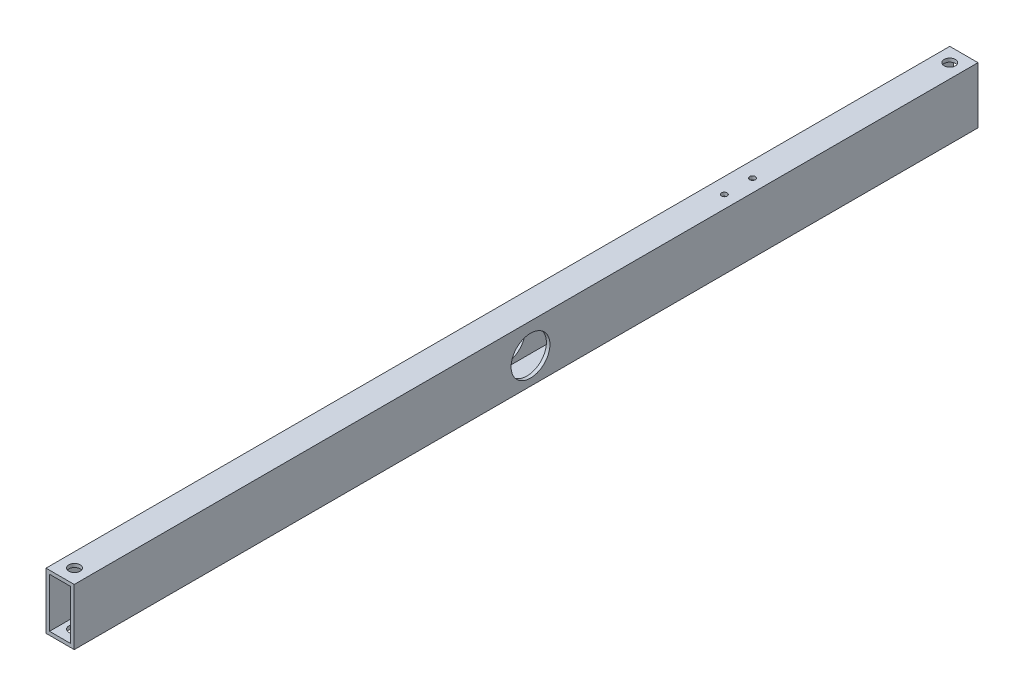
ISO-10303-21;
HEADER;
FILE_DESCRIPTION(('STEP AP214'),'2;1');
FILE_NAME('part.step','',(''),(''),'','','');
FILE_SCHEMA(('AUTOMOTIVE_DESIGN { 1 0 10303 214 1 1 1 1 }'));
ENDSEC;
DATA;
#1=APPLICATION_CONTEXT('core data for automotive mechanical design processes');
#2=APPLICATION_PROTOCOL_DEFINITION('international standard','automotive_design',2000,#1);
#3=PRODUCT_CONTEXT('',#1,'mechanical');
#4=PRODUCT('Part','Part','',(#3));
#5=PRODUCT_RELATED_PRODUCT_CATEGORY('part','',(#4));
#6=PRODUCT_DEFINITION_FORMATION('','',#4);
#7=PRODUCT_DEFINITION_CONTEXT('part definition',#1,'design');
#8=PRODUCT_DEFINITION('design','',#6,#7);
#9=PRODUCT_DEFINITION_SHAPE('','',#8);
#10=(LENGTH_UNIT() NAMED_UNIT(*) SI_UNIT(.MILLI.,.METRE.));
#11=(NAMED_UNIT(*) PLANE_ANGLE_UNIT() SI_UNIT($,.RADIAN.));
#12=(NAMED_UNIT(*) SI_UNIT($,.STERADIAN.) SOLID_ANGLE_UNIT());
#13=UNCERTAINTY_MEASURE_WITH_UNIT(LENGTH_MEASURE(1.E-05),#10,'distance_accuracy_value','');
#14=(GEOMETRIC_REPRESENTATION_CONTEXT(3) GLOBAL_UNCERTAINTY_ASSIGNED_CONTEXT((#13)) GLOBAL_UNIT_ASSIGNED_CONTEXT((#10,
#11,#12)) REPRESENTATION_CONTEXT('',''));
#15=CARTESIAN_POINT('',(0.,0.,0.));
#16=DIRECTION('',(0.,0.,1.));
#17=DIRECTION('',(1.,0.,0.));
#18=AXIS2_PLACEMENT_3D('',#15,#16,#17);
#19=CARTESIAN_POINT('',(12.7,-1.5875,-3.937));
#20=DIRECTION('',(1.,0.,0.));
#21=DIRECTION('',(0.,0.,-1.));
#22=AXIS2_PLACEMENT_3D('',#19,#20,#21);
#23=CYLINDRICAL_SURFACE('',#22,17.4625);
#24=CARTESIAN_POINT('',(-9.525,-1.5875,-3.937));
#25=DIRECTION('',(1.,0.,0.));
#26=DIRECTION('',(0.,0.,-1.));
#27=AXIS2_PLACEMENT_3D('',#24,#25,#26);
#28=CIRCLE('',#27,17.4625);
#29=CARTESIAN_POINT('',(-9.525,-1.5875,-21.3995));
#30=VERTEX_POINT('',#29);
#31=EDGE_CURVE('E88',#30,#30,#28,.F.);
#32=ORIENTED_EDGE('',*,*,#31,.F.);
#33=EDGE_LOOP('',(#32));
#34=FACE_BOUND('',#33,.T.);
#35=CARTESIAN_POINT('',(-12.7,-1.5875,-3.937));
#36=DIRECTION('',(1.,0.,0.));
#37=DIRECTION('',(0.,0.,-1.));
#38=AXIS2_PLACEMENT_3D('',#35,#36,#37);
#39=CIRCLE('',#38,17.4625);
#40=CARTESIAN_POINT('',(-12.7,-1.5875,-21.3995));
#41=VERTEX_POINT('',#40);
#42=EDGE_CURVE('E19',#41,#41,#39,.T.);
#43=ORIENTED_EDGE('',*,*,#42,.F.);
#44=EDGE_LOOP('',(#43));
#45=FACE_BOUND('',#44,.T.);
#46=ADVANCED_FACE('F16',(#34,#45),#23,.F.);
#47=CARTESIAN_POINT('',(0.000102088823020803,25.4,393.45578642315));
#48=DIRECTION('',(0.,1.,0.));
#49=DIRECTION('',(0.,0.,1.));
#50=AXIS2_PLACEMENT_3D('',#47,#48,#49);
#51=CYLINDRICAL_SURFACE('',#50,5.0419);
#52=CARTESIAN_POINT('',(0.000102088823020803,22.225,393.45578642315));
#53=DIRECTION('',(0.,1.,0.));
#54=DIRECTION('',(0.,0.,1.));
#55=AXIS2_PLACEMENT_3D('',#52,#53,#54);
#56=CIRCLE('',#55,5.0419);
#57=CARTESIAN_POINT('',(0.000102088823020803,22.225,398.49768642315));
#58=VERTEX_POINT('',#57);
#59=EDGE_CURVE('E124',#58,#58,#56,.T.);
#60=ORIENTED_EDGE('',*,*,#59,.F.);
#61=EDGE_LOOP('',(#60));
#62=FACE_BOUND('',#61,.T.);
#63=CARTESIAN_POINT('',(0.000102088823020803,25.4,393.45578642315));
#64=DIRECTION('',(0.,1.,0.));
#65=DIRECTION('',(0.,0.,1.));
#66=AXIS2_PLACEMENT_3D('',#63,#64,#65);
#67=CIRCLE('',#66,5.0419);
#68=CARTESIAN_POINT('',(0.000102088823020803,25.4,398.49768642315));
#69=VERTEX_POINT('',#68);
#70=EDGE_CURVE('E118',#69,#69,#67,.F.);
#71=ORIENTED_EDGE('',*,*,#70,.F.);
#72=EDGE_LOOP('',(#71));
#73=FACE_BOUND('',#72,.T.);
#74=ADVANCED_FACE('F185',(#62,#73),#51,.F.);
#75=CARTESIAN_POINT('',(-1.53406176650609E-12,25.4,-393.7));
#76=DIRECTION('',(0.,1.,0.));
#77=DIRECTION('',(0.,0.,1.));
#78=AXIS2_PLACEMENT_3D('',#75,#76,#77);
#79=CYLINDRICAL_SURFACE('',#78,5.0419);
#80=CARTESIAN_POINT('',(-1.53406176650609E-12,22.225,-393.7));
#81=DIRECTION('',(0.,1.,0.));
#82=DIRECTION('',(0.,0.,1.));
#83=AXIS2_PLACEMENT_3D('',#80,#81,#82);
#84=CIRCLE('',#83,5.0419);
#85=CARTESIAN_POINT('',(-1.53406176650609E-12,22.225,-388.6581));
#86=VERTEX_POINT('',#85);
#87=EDGE_CURVE('E160',#86,#86,#84,.T.);
#88=ORIENTED_EDGE('',*,*,#87,.F.);
#89=EDGE_LOOP('',(#88));
#90=FACE_BOUND('',#89,.T.);
#91=CARTESIAN_POINT('',(-1.53406176650609E-12,25.4,-393.7));
#92=DIRECTION('',(0.,1.,0.));
#93=DIRECTION('',(0.,0.,1.));
#94=AXIS2_PLACEMENT_3D('',#91,#92,#93);
#95=CIRCLE('',#94,5.0419);
#96=CARTESIAN_POINT('',(-1.53406176650609E-12,25.4,-388.6581));
#97=VERTEX_POINT('',#96);
#98=EDGE_CURVE('E150',#97,#97,#95,.F.);
#99=ORIENTED_EDGE('',*,*,#98,.F.);
#100=EDGE_LOOP('',(#99));
#101=FACE_BOUND('',#100,.T.);
#102=ADVANCED_FACE('F191',(#90,#101),#79,.F.);
#103=CARTESIAN_POINT('',(1.27,-25.4,-215.0618));
#104=DIRECTION('',(0.,-1.,0.));
#105=DIRECTION('',(0.,0.,-1.));
#106=AXIS2_PLACEMENT_3D('',#103,#104,#105);
#107=CYLINDRICAL_SURFACE('',#106,2.5527);
#108=CARTESIAN_POINT('',(1.27,22.225,-215.0618));
#109=DIRECTION('',(0.,-1.,0.));
#110=DIRECTION('',(0.,0.,-1.));
#111=AXIS2_PLACEMENT_3D('',#108,#109,#110);
#112=CIRCLE('',#111,2.5527);
#113=CARTESIAN_POINT('',(1.27,22.225,-217.6145));
#114=VERTEX_POINT('',#113);
#115=EDGE_CURVE('E157',#114,#114,#112,.F.);
#116=ORIENTED_EDGE('',*,*,#115,.F.);
#117=EDGE_LOOP('',(#116));
#118=FACE_BOUND('',#117,.T.);
#119=CARTESIAN_POINT('',(1.27,25.4,-215.0618));
#120=DIRECTION('',(0.,-1.,0.));
#121=DIRECTION('',(0.,0.,-1.));
#122=AXIS2_PLACEMENT_3D('',#119,#120,#121);
#123=CIRCLE('',#122,2.5527);
#124=CARTESIAN_POINT('',(1.27,25.4,-217.6145));
#125=VERTEX_POINT('',#124);
#126=EDGE_CURVE('E147',#125,#125,#123,.T.);
#127=ORIENTED_EDGE('',*,*,#126,.F.);
#128=EDGE_LOOP('',(#127));
#129=FACE_BOUND('',#128,.T.);
#130=ADVANCED_FACE('F255',(#118,#129),#107,.F.);
#131=CARTESIAN_POINT('',(1.27,-25.4,-189.6618));
#132=DIRECTION('',(0.,-1.,0.));
#133=DIRECTION('',(0.,0.,-1.));
#134=AXIS2_PLACEMENT_3D('',#131,#132,#133);
#135=CYLINDRICAL_SURFACE('',#134,2.5527);
#136=CARTESIAN_POINT('',(1.27,22.225,-189.6618));
#137=DIRECTION('',(0.,-1.,0.));
#138=DIRECTION('',(0.,0.,-1.));
#139=AXIS2_PLACEMENT_3D('',#136,#137,#138);
#140=CIRCLE('',#139,2.5527);
#141=CARTESIAN_POINT('',(1.27,22.225,-192.2145));
#142=VERTEX_POINT('',#141);
#143=EDGE_CURVE('E123',#142,#142,#140,.F.);
#144=ORIENTED_EDGE('',*,*,#143,.F.);
#145=EDGE_LOOP('',(#144));
#146=FACE_BOUND('',#145,.T.);
#147=CARTESIAN_POINT('',(1.27,25.4,-189.6618));
#148=DIRECTION('',(0.,-1.,0.));
#149=DIRECTION('',(0.,0.,-1.));
#150=AXIS2_PLACEMENT_3D('',#147,#148,#149);
#151=CIRCLE('',#150,2.5527);
#152=CARTESIAN_POINT('',(1.27,25.4,-192.2145));
#153=VERTEX_POINT('',#152);
#154=EDGE_CURVE('E114',#153,#153,#151,.T.);
#155=ORIENTED_EDGE('',*,*,#154,.F.);
#156=EDGE_LOOP('',(#155));
#157=FACE_BOUND('',#156,.T.);
#158=ADVANCED_FACE('F251',(#146,#157),#135,.F.);
#159=CARTESIAN_POINT('',(0.000102088823020803,25.4,393.45578642315));
#160=DIRECTION('',(0.,1.,0.));
#161=DIRECTION('',(0.,0.,1.));
#162=AXIS2_PLACEMENT_3D('',#159,#160,#161);
#163=CYLINDRICAL_SURFACE('',#162,5.0419);
#164=CARTESIAN_POINT('',(0.000102088823020803,-22.225,393.45578642315));
#165=DIRECTION('',(0.,1.,0.));
#166=DIRECTION('',(0.,0.,1.));
#167=AXIS2_PLACEMENT_3D('',#164,#165,#166);
#168=CIRCLE('',#167,5.0419);
#169=CARTESIAN_POINT('',(0.000102088823020803,-22.225,398.49768642315));
#170=VERTEX_POINT('',#169);
#171=EDGE_CURVE('E174',#170,#170,#168,.F.);
#172=ORIENTED_EDGE('',*,*,#171,.F.);
#173=EDGE_LOOP('',(#172));
#174=FACE_BOUND('',#173,.T.);
#175=CARTESIAN_POINT('',(0.000102088823020803,-25.4,393.45578642315));
#176=DIRECTION('',(0.,1.,0.));
#177=DIRECTION('',(0.,0.,1.));
#178=AXIS2_PLACEMENT_3D('',#175,#176,#177);
#179=CIRCLE('',#178,5.0419);
#180=CARTESIAN_POINT('',(0.000102088823020803,-25.4,398.49768642315));
#181=VERTEX_POINT('',#180);
#182=EDGE_CURVE('E141',#181,#181,#179,.T.);
#183=ORIENTED_EDGE('',*,*,#182,.F.);
#184=EDGE_LOOP('',(#183));
#185=FACE_BOUND('',#184,.T.);
#186=ADVANCED_FACE('F247',(#174,#185),#163,.F.);
#187=CARTESIAN_POINT('',(-1.53406176650609E-12,25.4,-393.7));
#188=DIRECTION('',(0.,1.,0.));
#189=DIRECTION('',(0.,0.,1.));
#190=AXIS2_PLACEMENT_3D('',#187,#188,#189);
#191=CYLINDRICAL_SURFACE('',#190,5.0419);
#192=CARTESIAN_POINT('',(-1.53406176650609E-12,-22.225,-393.7));
#193=DIRECTION('',(0.,1.,0.));
#194=DIRECTION('',(0.,0.,1.));
#195=AXIS2_PLACEMENT_3D('',#192,#193,#194);
#196=CIRCLE('',#195,5.0419);
#197=CARTESIAN_POINT('',(-1.53406176650609E-12,-22.225,-388.6581));
#198=VERTEX_POINT('',#197);
#199=EDGE_CURVE('E172',#198,#198,#196,.F.);
#200=ORIENTED_EDGE('',*,*,#199,.F.);
#201=EDGE_LOOP('',(#200));
#202=FACE_BOUND('',#201,.T.);
#203=CARTESIAN_POINT('',(-1.53406176650609E-12,-25.4,-393.7));
#204=DIRECTION('',(0.,1.,0.));
#205=DIRECTION('',(0.,0.,1.));
#206=AXIS2_PLACEMENT_3D('',#203,#204,#205);
#207=CIRCLE('',#206,5.0419);
#208=CARTESIAN_POINT('',(-1.53406176650609E-12,-25.4,-388.6581));
#209=VERTEX_POINT('',#208);
#210=EDGE_CURVE('E138',#209,#209,#207,.T.);
#211=ORIENTED_EDGE('',*,*,#210,.F.);
#212=EDGE_LOOP('',(#211));
#213=FACE_BOUND('',#212,.T.);
#214=ADVANCED_FACE('F243',(#202,#213),#191,.F.);
#215=CARTESIAN_POINT('',(1.27,-25.4,-215.0618));
#216=DIRECTION('',(0.,-1.,0.));
#217=DIRECTION('',(0.,0.,-1.));
#218=AXIS2_PLACEMENT_3D('',#215,#216,#217);
#219=CYLINDRICAL_SURFACE('',#218,2.5527);
#220=CARTESIAN_POINT('',(1.27,-22.225,-215.0618));
#221=DIRECTION('',(0.,-1.,0.));
#222=DIRECTION('',(0.,0.,-1.));
#223=AXIS2_PLACEMENT_3D('',#220,#221,#222);
#224=CIRCLE('',#223,2.5527);
#225=CARTESIAN_POINT('',(1.27,-22.225,-217.6145));
#226=VERTEX_POINT('',#225);
#227=EDGE_CURVE('E169',#226,#226,#224,.T.);
#228=ORIENTED_EDGE('',*,*,#227,.F.);
#229=EDGE_LOOP('',(#228));
#230=FACE_BOUND('',#229,.T.);
#231=CARTESIAN_POINT('',(1.27,-25.4,-215.0618));
#232=DIRECTION('',(0.,-1.,0.));
#233=DIRECTION('',(0.,0.,-1.));
#234=AXIS2_PLACEMENT_3D('',#231,#232,#233);
#235=CIRCLE('',#234,2.5527);
#236=CARTESIAN_POINT('',(1.27,-25.4,-217.6145));
#237=VERTEX_POINT('',#236);
#238=EDGE_CURVE('E135',#237,#237,#235,.F.);
#239=ORIENTED_EDGE('',*,*,#238,.F.);
#240=EDGE_LOOP('',(#239));
#241=FACE_BOUND('',#240,.T.);
#242=ADVANCED_FACE('F239',(#230,#241),#219,.F.);
#243=CARTESIAN_POINT('',(1.27,-25.4,-189.6618));
#244=DIRECTION('',(0.,-1.,0.));
#245=DIRECTION('',(0.,0.,-1.));
#246=AXIS2_PLACEMENT_3D('',#243,#244,#245);
#247=CYLINDRICAL_SURFACE('',#246,2.5527);
#248=CARTESIAN_POINT('',(1.27,-22.225,-189.6618));
#249=DIRECTION('',(0.,-1.,0.));
#250=DIRECTION('',(0.,0.,-1.));
#251=AXIS2_PLACEMENT_3D('',#248,#249,#250);
#252=CIRCLE('',#251,2.5527);
#253=CARTESIAN_POINT('',(1.27,-22.225,-192.2145));
#254=VERTEX_POINT('',#253);
#255=EDGE_CURVE('E89',#254,#254,#252,.T.);
#256=ORIENTED_EDGE('',*,*,#255,.F.);
#257=EDGE_LOOP('',(#256));
#258=FACE_BOUND('',#257,.T.);
#259=CARTESIAN_POINT('',(1.27,-25.4,-189.6618));
#260=DIRECTION('',(0.,-1.,0.));
#261=DIRECTION('',(0.,0.,-1.));
#262=AXIS2_PLACEMENT_3D('',#259,#260,#261);
#263=CIRCLE('',#262,2.5527);
#264=CARTESIAN_POINT('',(1.27,-25.4,-192.2145));
#265=VERTEX_POINT('',#264);
#266=EDGE_CURVE('E131',#265,#265,#263,.F.);
#267=ORIENTED_EDGE('',*,*,#266,.F.);
#268=EDGE_LOOP('',(#267));
#269=FACE_BOUND('',#268,.T.);
#270=ADVANCED_FACE('F236',(#258,#269),#247,.F.);
#271=CARTESIAN_POINT('',(-12.7,25.4,-406.4));
#272=DIRECTION('',(-1.,0.,0.));
#273=DIRECTION('',(0.,0.,1.));
#274=AXIS2_PLACEMENT_3D('',#271,#272,#273);
#275=PLANE('',#274);
#276=ORIENTED_EDGE('',*,*,#42,.T.);
#277=EDGE_LOOP('',(#276));
#278=FACE_BOUND('',#277,.T.);
#279=DIRECTION('',(0.,0.,1.));
#280=VECTOR('',#279,1.);
#281=CARTESIAN_POINT('',(-12.7,25.4,-406.4));
#282=LINE('',#281,#280);
#283=CARTESIAN_POINT('',(-12.7,25.4,-406.4));
#284=VERTEX_POINT('',#283);
#285=CARTESIAN_POINT('',(-12.7,25.4,406.4));
#286=VERTEX_POINT('',#285);
#287=EDGE_CURVE('E115',#284,#286,#282,.T.);
#288=ORIENTED_EDGE('',*,*,#287,.F.);
#289=DIRECTION('',(0.,1.,0.));
#290=VECTOR('',#289,1.);
#291=CARTESIAN_POINT('',(-12.7,0.,-406.4));
#292=LINE('',#291,#290);
#293=CARTESIAN_POINT('',(-12.7,-25.4,-406.4));
#294=VERTEX_POINT('',#293);
#295=EDGE_CURVE('E282',#284,#294,#292,.F.);
#296=ORIENTED_EDGE('',*,*,#295,.T.);
#297=DIRECTION('',(0.,0.,-1.));
#298=VECTOR('',#297,1.);
#299=CARTESIAN_POINT('',(-12.7,-25.4,-406.4));
#300=LINE('',#299,#298);
#301=CARTESIAN_POINT('',(-12.7,-25.4,406.4));
#302=VERTEX_POINT('',#301);
#303=EDGE_CURVE('E144',#302,#294,#300,.T.);
#304=ORIENTED_EDGE('',*,*,#303,.F.);
#305=DIRECTION('',(0.,1.,0.));
#306=VECTOR('',#305,1.);
#307=CARTESIAN_POINT('',(-12.7,0.,406.4));
#308=LINE('',#307,#306);
#309=EDGE_CURVE('E109',#286,#302,#308,.F.);
#310=ORIENTED_EDGE('',*,*,#309,.F.);
#311=EDGE_LOOP('',(#288,#296,#304,#310));
#312=FACE_BOUND('',#311,.T.);
#313=ADVANCED_FACE('F181',(#278,#312),#275,.T.);
#314=CARTESIAN_POINT('',(9.525,-22.225,-406.4));
#315=DIRECTION('',(0.,1.,0.));
#316=DIRECTION('',(0.,0.,1.));
#317=AXIS2_PLACEMENT_3D('',#314,#315,#316);
#318=PLANE('',#317);
#319=ORIENTED_EDGE('',*,*,#255,.T.);
#320=EDGE_LOOP('',(#319));
#321=FACE_BOUND('',#320,.T.);
#322=ORIENTED_EDGE('',*,*,#227,.T.);
#323=EDGE_LOOP('',(#322));
#324=FACE_BOUND('',#323,.T.);
#325=ORIENTED_EDGE('',*,*,#199,.T.);
#326=EDGE_LOOP('',(#325));
#327=FACE_BOUND('',#326,.T.);
#328=ORIENTED_EDGE('',*,*,#171,.T.);
#329=EDGE_LOOP('',(#328));
#330=FACE_BOUND('',#329,.T.);
#331=DIRECTION('',(0.,0.,1.));
#332=VECTOR('',#331,1.);
#333=CARTESIAN_POINT('',(9.525,-22.225,-406.4));
#334=LINE('',#333,#332);
#335=CARTESIAN_POINT('',(9.525,-22.225,-406.4));
#336=VERTEX_POINT('',#335);
#337=CARTESIAN_POINT('',(9.525,-22.225,406.4));
#338=VERTEX_POINT('',#337);
#339=EDGE_CURVE('E121',#336,#338,#334,.T.);
#340=ORIENTED_EDGE('',*,*,#339,.F.);
#341=DIRECTION('',(1.,0.,0.));
#342=VECTOR('',#341,1.);
#343=CARTESIAN_POINT('',(0.,-22.225,-406.4));
#344=LINE('',#343,#342);
#345=CARTESIAN_POINT('',(-9.525,-22.225,-406.4));
#346=VERTEX_POINT('',#345);
#347=EDGE_CURVE('E85',#336,#346,#344,.F.);
#348=ORIENTED_EDGE('',*,*,#347,.T.);
#349=DIRECTION('',(0.,0.,-1.));
#350=VECTOR('',#349,1.);
#351=CARTESIAN_POINT('',(-9.525,-22.225,-406.4));
#352=LINE('',#351,#350);
#353=CARTESIAN_POINT('',(-9.525,-22.225,406.4));
#354=VERTEX_POINT('',#353);
#355=EDGE_CURVE('E78',#354,#346,#352,.T.);
#356=ORIENTED_EDGE('',*,*,#355,.F.);
#357=DIRECTION('',(1.,0.,0.));
#358=VECTOR('',#357,1.);
#359=CARTESIAN_POINT('',(0.,-22.225,406.4));
#360=LINE('',#359,#358);
#361=EDGE_CURVE('E82',#338,#354,#360,.F.);
#362=ORIENTED_EDGE('',*,*,#361,.F.);
#363=EDGE_LOOP('',(#340,#348,#356,#362));
#364=FACE_BOUND('',#363,.T.);
#365=ADVANCED_FACE('F80',(#321,#324,#327,#330,#364),#318,.T.);
#366=CARTESIAN_POINT('',(-9.525,-22.225,-406.4));
#367=DIRECTION('',(1.,0.,0.));
#368=DIRECTION('',(0.,0.,-1.));
#369=AXIS2_PLACEMENT_3D('',#366,#367,#368);
#370=PLANE('',#369);
#371=ORIENTED_EDGE('',*,*,#31,.T.);
#372=EDGE_LOOP('',(#371));
#373=FACE_BOUND('',#372,.T.);
#374=ORIENTED_EDGE('',*,*,#355,.T.);
#375=DIRECTION('',(0.,1.,0.));
#376=VECTOR('',#375,1.);
#377=CARTESIAN_POINT('',(-9.525,0.,-406.4));
#378=LINE('',#377,#376);
#379=CARTESIAN_POINT('',(-9.525,22.225,-406.4));
#380=VERTEX_POINT('',#379);
#381=EDGE_CURVE('E291',#346,#380,#378,.T.);
#382=ORIENTED_EDGE('',*,*,#381,.T.);
#383=DIRECTION('',(0.,0.,-1.));
#384=VECTOR('',#383,1.);
#385=CARTESIAN_POINT('',(-9.525,22.225,-406.4));
#386=LINE('',#385,#384);
#387=CARTESIAN_POINT('',(-9.525,22.225,406.4));
#388=VERTEX_POINT('',#387);
#389=EDGE_CURVE('E95',#388,#380,#386,.T.);
#390=ORIENTED_EDGE('',*,*,#389,.F.);
#391=DIRECTION('',(0.,1.,0.));
#392=VECTOR('',#391,1.);
#393=CARTESIAN_POINT('',(-9.525,0.,406.4));
#394=LINE('',#393,#392);
#395=EDGE_CURVE('E92',#354,#388,#394,.T.);
#396=ORIENTED_EDGE('',*,*,#395,.F.);
#397=EDGE_LOOP('',(#374,#382,#390,#396));
#398=FACE_BOUND('',#397,.T.);
#399=ADVANCED_FACE('F93',(#373,#398),#370,.T.);
#400=CARTESIAN_POINT('',(-9.525,22.225,-406.4));
#401=DIRECTION('',(0.,-1.,0.));
#402=DIRECTION('',(0.,0.,-1.));
#403=AXIS2_PLACEMENT_3D('',#400,#401,#402);
#404=PLANE('',#403);
#405=ORIENTED_EDGE('',*,*,#143,.T.);
#406=EDGE_LOOP('',(#405));
#407=FACE_BOUND('',#406,.T.);
#408=ORIENTED_EDGE('',*,*,#115,.T.);
#409=EDGE_LOOP('',(#408));
#410=FACE_BOUND('',#409,.T.);
#411=ORIENTED_EDGE('',*,*,#87,.T.);
#412=EDGE_LOOP('',(#411));
#413=FACE_BOUND('',#412,.T.);
#414=ORIENTED_EDGE('',*,*,#59,.T.);
#415=EDGE_LOOP('',(#414));
#416=FACE_BOUND('',#415,.T.);
#417=ORIENTED_EDGE('',*,*,#389,.T.);
#418=DIRECTION('',(1.,0.,0.));
#419=VECTOR('',#418,1.);
#420=CARTESIAN_POINT('',(0.,22.225,-406.4));
#421=LINE('',#420,#419);
#422=CARTESIAN_POINT('',(9.525,22.225,-406.4));
#423=VERTEX_POINT('',#422);
#424=EDGE_CURVE('E130',#380,#423,#421,.T.);
#425=ORIENTED_EDGE('',*,*,#424,.T.);
#426=DIRECTION('',(0.,0.,1.));
#427=VECTOR('',#426,1.);
#428=CARTESIAN_POINT('',(9.525,22.225,-406.4));
#429=LINE('',#428,#427);
#430=CARTESIAN_POINT('',(9.525,22.225,406.4));
#431=VERTEX_POINT('',#430);
#432=EDGE_CURVE('E119',#431,#423,#429,.F.);
#433=ORIENTED_EDGE('',*,*,#432,.F.);
#434=DIRECTION('',(1.,0.,0.));
#435=VECTOR('',#434,1.);
#436=CARTESIAN_POINT('',(0.,22.225,406.4));
#437=LINE('',#436,#435);
#438=EDGE_CURVE('E99',#388,#431,#437,.T.);
#439=ORIENTED_EDGE('',*,*,#438,.F.);
#440=EDGE_LOOP('',(#417,#425,#433,#439));
#441=FACE_BOUND('',#440,.T.);
#442=ADVANCED_FACE('F223',(#407,#410,#413,#416,#441),#404,.T.);
#443=CARTESIAN_POINT('',(9.525,22.225,-406.4));
#444=DIRECTION('',(-1.,0.,0.));
#445=DIRECTION('',(0.,0.,1.));
#446=AXIS2_PLACEMENT_3D('',#443,#444,#445);
#447=PLANE('',#446);
#448=CARTESIAN_POINT('',(9.525,-1.5875,-3.937));
#449=DIRECTION('',(1.,0.,0.));
#450=DIRECTION('',(0.,0.,-1.));
#451=AXIS2_PLACEMENT_3D('',#448,#449,#450);
#452=CIRCLE('',#451,17.4625);
#453=CARTESIAN_POINT('',(9.525,-1.5875,-21.3995));
#454=VERTEX_POINT('',#453);
#455=EDGE_CURVE('E126',#454,#454,#452,.T.);
#456=ORIENTED_EDGE('',*,*,#455,.T.);
#457=EDGE_LOOP('',(#456));
#458=FACE_BOUND('',#457,.T.);
#459=ORIENTED_EDGE('',*,*,#432,.T.);
#460=DIRECTION('',(0.,1.,0.));
#461=VECTOR('',#460,1.);
#462=CARTESIAN_POINT('',(9.525,0.,-406.4));
#463=LINE('',#462,#461);
#464=EDGE_CURVE('E294',#423,#336,#463,.F.);
#465=ORIENTED_EDGE('',*,*,#464,.T.);
#466=ORIENTED_EDGE('',*,*,#339,.T.);
#467=DIRECTION('',(0.,1.,0.));
#468=VECTOR('',#467,1.);
#469=CARTESIAN_POINT('',(9.525,0.,406.4));
#470=LINE('',#469,#468);
#471=EDGE_CURVE('E105',#431,#338,#470,.F.);
#472=ORIENTED_EDGE('',*,*,#471,.F.);
#473=EDGE_LOOP('',(#459,#465,#466,#472));
#474=FACE_BOUND('',#473,.T.);
#475=ADVANCED_FACE('F219',(#458,#474),#447,.T.);
#476=CARTESIAN_POINT('',(12.7,25.4,-406.4));
#477=DIRECTION('',(0.,1.,0.));
#478=DIRECTION('',(0.,0.,1.));
#479=AXIS2_PLACEMENT_3D('',#476,#477,#478);
#480=PLANE('',#479);
#481=ORIENTED_EDGE('',*,*,#154,.T.);
#482=EDGE_LOOP('',(#481));
#483=FACE_BOUND('',#482,.T.);
#484=ORIENTED_EDGE('',*,*,#126,.T.);
#485=EDGE_LOOP('',(#484));
#486=FACE_BOUND('',#485,.T.);
#487=ORIENTED_EDGE('',*,*,#98,.T.);
#488=EDGE_LOOP('',(#487));
#489=FACE_BOUND('',#488,.T.);
#490=ORIENTED_EDGE('',*,*,#70,.T.);
#491=EDGE_LOOP('',(#490));
#492=FACE_BOUND('',#491,.T.);
#493=DIRECTION('',(0.,0.,-1.));
#494=VECTOR('',#493,1.);
#495=CARTESIAN_POINT('',(12.7,25.4,-406.4));
#496=LINE('',#495,#494);
#497=CARTESIAN_POINT('',(12.7,25.4,-406.4));
#498=VERTEX_POINT('',#497);
#499=CARTESIAN_POINT('',(12.7,25.4,406.4));
#500=VERTEX_POINT('',#499);
#501=EDGE_CURVE('E129',#498,#500,#496,.F.);
#502=ORIENTED_EDGE('',*,*,#501,.F.);
#503=DIRECTION('',(1.,0.,0.));
#504=VECTOR('',#503,1.);
#505=CARTESIAN_POINT('',(0.,25.4,-406.4));
#506=LINE('',#505,#504);
#507=EDGE_CURVE('E134',#498,#284,#506,.F.);
#508=ORIENTED_EDGE('',*,*,#507,.T.);
#509=ORIENTED_EDGE('',*,*,#287,.T.);
#510=DIRECTION('',(1.,0.,0.));
#511=VECTOR('',#510,1.);
#512=CARTESIAN_POINT('',(0.,25.4,406.4));
#513=LINE('',#512,#511);
#514=EDGE_CURVE('E106',#500,#286,#513,.F.);
#515=ORIENTED_EDGE('',*,*,#514,.F.);
#516=EDGE_LOOP('',(#502,#508,#509,#515));
#517=FACE_BOUND('',#516,.T.);
#518=ADVANCED_FACE('F216',(#483,#486,#489,#492,#517),#480,.T.);
#519=CARTESIAN_POINT('',(0.,0.,406.4));
#520=DIRECTION('',(0.,0.,1.));
#521=DIRECTION('',(1.,0.,0.));
#522=AXIS2_PLACEMENT_3D('',#519,#520,#521);
#523=PLANE('',#522);
#524=ORIENTED_EDGE('',*,*,#438,.T.);
#525=ORIENTED_EDGE('',*,*,#471,.T.);
#526=ORIENTED_EDGE('',*,*,#361,.T.);
#527=ORIENTED_EDGE('',*,*,#395,.T.);
#528=EDGE_LOOP('',(#524,#525,#526,#527));
#529=FACE_BOUND('',#528,.T.);
#530=DIRECTION('',(0.,1.,0.));
#531=VECTOR('',#530,1.);
#532=CARTESIAN_POINT('',(12.7,-25.4,406.4));
#533=LINE('',#532,#531);
#534=CARTESIAN_POINT('',(12.7,-25.4,406.4));
#535=VERTEX_POINT('',#534);
#536=EDGE_CURVE('E278',#500,#535,#533,.F.);
#537=ORIENTED_EDGE('',*,*,#536,.F.);
#538=ORIENTED_EDGE('',*,*,#514,.T.);
#539=ORIENTED_EDGE('',*,*,#309,.T.);
#540=DIRECTION('',(1.,0.,0.));
#541=VECTOR('',#540,1.);
#542=CARTESIAN_POINT('',(-12.7,-25.4,406.4));
#543=LINE('',#542,#541);
#544=EDGE_CURVE('E300',#535,#302,#543,.F.);
#545=ORIENTED_EDGE('',*,*,#544,.F.);
#546=EDGE_LOOP('',(#537,#538,#539,#545));
#547=FACE_BOUND('',#546,.T.);
#548=ADVANCED_FACE('F102',(#529,#547),#523,.T.);
#549=CARTESIAN_POINT('',(-12.7,-25.4,-406.4));
#550=DIRECTION('',(0.,-1.,0.));
#551=DIRECTION('',(0.,0.,-1.));
#552=AXIS2_PLACEMENT_3D('',#549,#550,#551);
#553=PLANE('',#552);
#554=ORIENTED_EDGE('',*,*,#266,.T.);
#555=EDGE_LOOP('',(#554));
#556=FACE_BOUND('',#555,.T.);
#557=ORIENTED_EDGE('',*,*,#238,.T.);
#558=EDGE_LOOP('',(#557));
#559=FACE_BOUND('',#558,.T.);
#560=ORIENTED_EDGE('',*,*,#210,.T.);
#561=EDGE_LOOP('',(#560));
#562=FACE_BOUND('',#561,.T.);
#563=ORIENTED_EDGE('',*,*,#182,.T.);
#564=EDGE_LOOP('',(#563));
#565=FACE_BOUND('',#564,.T.);
#566=ORIENTED_EDGE('',*,*,#303,.T.);
#567=DIRECTION('',(1.,0.,0.));
#568=VECTOR('',#567,1.);
#569=CARTESIAN_POINT('',(0.,-25.4,-406.4));
#570=LINE('',#569,#568);
#571=CARTESIAN_POINT('',(12.7,-25.4,-406.4));
#572=VERTEX_POINT('',#571);
#573=EDGE_CURVE('E34',#294,#572,#570,.T.);
#574=ORIENTED_EDGE('',*,*,#573,.T.);
#575=DIRECTION('',(0.,0.,-1.));
#576=VECTOR('',#575,1.);
#577=CARTESIAN_POINT('',(12.7,-25.4,-406.4));
#578=LINE('',#577,#576);
#579=EDGE_CURVE('E284',#535,#572,#578,.T.);
#580=ORIENTED_EDGE('',*,*,#579,.F.);
#581=ORIENTED_EDGE('',*,*,#544,.T.);
#582=EDGE_LOOP('',(#566,#574,#580,#581));
#583=FACE_BOUND('',#582,.T.);
#584=ADVANCED_FACE('F209',(#556,#559,#562,#565,#583),#553,.T.);
#585=CARTESIAN_POINT('',(0.,0.,-406.4));
#586=DIRECTION('',(0.,0.,1.));
#587=DIRECTION('',(1.,0.,0.));
#588=AXIS2_PLACEMENT_3D('',#585,#586,#587);
#589=PLANE('',#588);
#590=ORIENTED_EDGE('',*,*,#381,.F.);
#591=ORIENTED_EDGE('',*,*,#347,.F.);
#592=ORIENTED_EDGE('',*,*,#464,.F.);
#593=ORIENTED_EDGE('',*,*,#424,.F.);
#594=EDGE_LOOP('',(#590,#591,#592,#593));
#595=FACE_BOUND('',#594,.T.);
#596=ORIENTED_EDGE('',*,*,#573,.F.);
#597=ORIENTED_EDGE('',*,*,#295,.F.);
#598=ORIENTED_EDGE('',*,*,#507,.F.);
#599=DIRECTION('',(0.,1.,0.));
#600=VECTOR('',#599,1.);
#601=CARTESIAN_POINT('',(12.7,-25.4,-406.4));
#602=LINE('',#601,#600);
#603=EDGE_CURVE('E25',#572,#498,#602,.T.);
#604=ORIENTED_EDGE('',*,*,#603,.F.);
#605=EDGE_LOOP('',(#596,#597,#598,#604));
#606=FACE_BOUND('',#605,.T.);
#607=ADVANCED_FACE('F202',(#595,#606),#589,.F.);
#608=CARTESIAN_POINT('',(12.7,-1.5875,-3.937));
#609=DIRECTION('',(1.,0.,0.));
#610=DIRECTION('',(0.,0.,-1.));
#611=AXIS2_PLACEMENT_3D('',#608,#609,#610);
#612=CYLINDRICAL_SURFACE('',#611,17.4625);
#613=ORIENTED_EDGE('',*,*,#455,.F.);
#614=EDGE_LOOP('',(#613));
#615=FACE_BOUND('',#614,.T.);
#616=CARTESIAN_POINT('',(12.7,-1.5875,-3.937));
#617=DIRECTION('',(1.,0.,0.));
#618=DIRECTION('',(0.,0.,-1.));
#619=AXIS2_PLACEMENT_3D('',#616,#617,#618);
#620=CIRCLE('',#619,17.4625);
#621=CARTESIAN_POINT('',(12.7,-1.5875,-21.3995));
#622=VERTEX_POINT('',#621);
#623=EDGE_CURVE('E11',#622,#622,#620,.F.);
#624=ORIENTED_EDGE('',*,*,#623,.F.);
#625=EDGE_LOOP('',(#624));
#626=FACE_BOUND('',#625,.T.);
#627=ADVANCED_FACE('F196',(#615,#626),#612,.F.);
#628=CARTESIAN_POINT('',(12.7,-25.4,-406.4));
#629=DIRECTION('',(1.,0.,0.));
#630=DIRECTION('',(0.,0.,-1.));
#631=AXIS2_PLACEMENT_3D('',#628,#629,#630);
#632=PLANE('',#631);
#633=ORIENTED_EDGE('',*,*,#623,.T.);
#634=EDGE_LOOP('',(#633));
#635=FACE_BOUND('',#634,.T.);
#636=ORIENTED_EDGE('',*,*,#579,.T.);
#637=ORIENTED_EDGE('',*,*,#603,.T.);
#638=ORIENTED_EDGE('',*,*,#501,.T.);
#639=ORIENTED_EDGE('',*,*,#536,.T.);
#640=EDGE_LOOP('',(#636,#637,#638,#639));
#641=FACE_BOUND('',#640,.T.);
#642=ADVANCED_FACE('F194',(#635,#641),#632,.T.);
#643=CLOSED_SHELL('',(#46,#74,#102,#130,#158,#186,#214,#242,#270,#313,#365,#399,#442,#475,#518,
#548,#584,#607,#627,#642));
#644=MANIFOLD_SOLID_BREP('B1',#643);
#645=ADVANCED_BREP_SHAPE_REPRESENTATION('',(#18,#644),#14);
#646=SHAPE_DEFINITION_REPRESENTATION(#9,#645);
ENDSEC;
END-ISO-10303-21;
